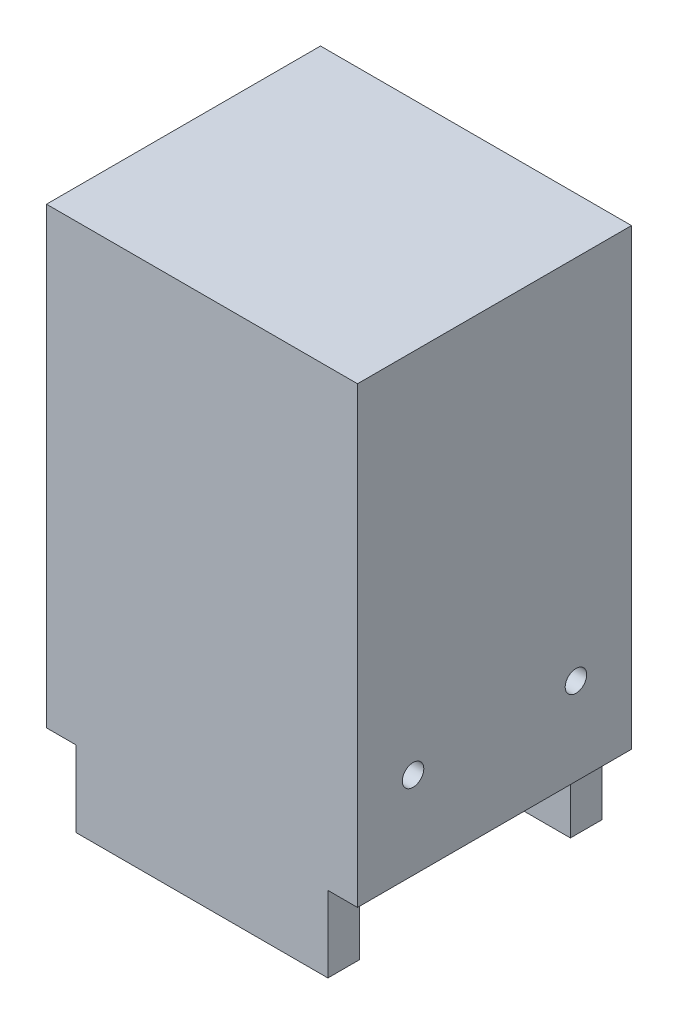
ISO-10303-21;
HEADER;
FILE_DESCRIPTION(('STEP AP214'),'2;1');
FILE_NAME('part.step','',(''),(''),'','','');
FILE_SCHEMA(('AUTOMOTIVE_DESIGN { 1 0 10303 214 1 1 1 1 }'));
ENDSEC;
DATA;
#1=APPLICATION_CONTEXT('core data for automotive mechanical design processes');
#2=APPLICATION_PROTOCOL_DEFINITION('international standard','automotive_design',2000,#1);
#3=PRODUCT_CONTEXT('',#1,'mechanical');
#4=PRODUCT('Part','Part','',(#3));
#5=PRODUCT_RELATED_PRODUCT_CATEGORY('part','',(#4));
#6=PRODUCT_DEFINITION_FORMATION('','',#4);
#7=PRODUCT_DEFINITION_CONTEXT('part definition',#1,'design');
#8=PRODUCT_DEFINITION('design','',#6,#7);
#9=PRODUCT_DEFINITION_SHAPE('','',#8);
#10=(LENGTH_UNIT() NAMED_UNIT(*) SI_UNIT(.MILLI.,.METRE.));
#11=(NAMED_UNIT(*) PLANE_ANGLE_UNIT() SI_UNIT($,.RADIAN.));
#12=(NAMED_UNIT(*) SI_UNIT($,.STERADIAN.) SOLID_ANGLE_UNIT());
#13=UNCERTAINTY_MEASURE_WITH_UNIT(LENGTH_MEASURE(1.E-05),#10,'distance_accuracy_value','');
#14=(GEOMETRIC_REPRESENTATION_CONTEXT(3) GLOBAL_UNCERTAINTY_ASSIGNED_CONTEXT((#13)) GLOBAL_UNIT_ASSIGNED_CONTEXT((#10,
#11,#12)) REPRESENTATION_CONTEXT('',''));
#15=CARTESIAN_POINT('',(0.,0.,0.));
#16=DIRECTION('',(0.,0.,1.));
#17=DIRECTION('',(1.,0.,0.));
#18=AXIS2_PLACEMENT_3D('',#15,#16,#17);
#19=CARTESIAN_POINT('',(-17.,0.,-55.));
#20=DIRECTION('',(1.,0.,0.));
#21=DIRECTION('',(0.,1.,0.));
#22=AXIS2_PLACEMENT_3D('',#19,#20,#21);
#23=PLANE('',#22);
#24=DIRECTION('',(0.,0.,1.));
#25=VECTOR('',#24,1.);
#26=CARTESIAN_POINT('',(-17.,-144.75,-55.));
#27=LINE('',#26,#25);
#28=CARTESIAN_POINT('',(-17.,-144.75,-41.75));
#29=VERTEX_POINT('',#28);
#30=CARTESIAN_POINT('',(-17.,-144.75,-13.25));
#31=VERTEX_POINT('',#30);
#32=EDGE_CURVE('E299',#29,#31,#27,.T.);
#33=ORIENTED_EDGE('',*,*,#32,.T.);
#34=DIRECTION('',(0.,1.,0.));
#35=VECTOR('',#34,1.);
#36=CARTESIAN_POINT('',(-17.,-169.75,-13.25));
#37=LINE('',#36,#35);
#38=CARTESIAN_POINT('',(-17.,-159.75,-13.25));
#39=VERTEX_POINT('',#38);
#40=EDGE_CURVE('E315',#39,#31,#37,.T.);
#41=ORIENTED_EDGE('',*,*,#40,.F.);
#42=DIRECTION('',(0.,0.,1.));
#43=VECTOR('',#42,1.);
#44=CARTESIAN_POINT('',(-17.,-159.75,-55.));
#45=LINE('',#44,#43);
#46=CARTESIAN_POINT('',(-17.,-159.75,-41.75));
#47=VERTEX_POINT('',#46);
#48=EDGE_CURVE('E275',#47,#39,#45,.T.);
#49=ORIENTED_EDGE('',*,*,#48,.F.);
#50=DIRECTION('',(0.,1.,0.));
#51=VECTOR('',#50,1.);
#52=CARTESIAN_POINT('',(-17.,-169.75,-41.75));
#53=LINE('',#52,#51);
#54=EDGE_CURVE('E292',#47,#29,#53,.T.);
#55=ORIENTED_EDGE('',*,*,#54,.T.);
#56=EDGE_LOOP('',(#33,#41,#49,#55));
#57=FACE_BOUND('',#56,.T.);
#58=CARTESIAN_POINT('',(-17.,-148.,-16.5));
#59=DIRECTION('',(1.,0.,0.));
#60=DIRECTION('',(0.,0.,-1.));
#61=AXIS2_PLACEMENT_3D('',#58,#59,#60);
#62=CIRCLE('',#61,1.45);
#63=CARTESIAN_POINT('',(-17.,-148.,-17.95));
#64=VERTEX_POINT('',#63);
#65=EDGE_CURVE('E196',#64,#64,#62,.T.);
#66=ORIENTED_EDGE('',*,*,#65,.F.);
#67=EDGE_LOOP('',(#66));
#68=FACE_BOUND('',#67,.T.);
#69=CARTESIAN_POINT('',(-17.,-148.,-38.5));
#70=DIRECTION('',(1.,0.,0.));
#71=DIRECTION('',(0.,0.,-1.));
#72=AXIS2_PLACEMENT_3D('',#69,#70,#71);
#73=CIRCLE('',#72,1.45);
#74=CARTESIAN_POINT('',(-17.,-148.,-39.95));
#75=VERTEX_POINT('',#74);
#76=EDGE_CURVE('E205',#75,#75,#73,.T.);
#77=ORIENTED_EDGE('',*,*,#76,.F.);
#78=EDGE_LOOP('',(#77));
#79=FACE_BOUND('',#78,.T.);
#80=ADVANCED_FACE('F47',(#57,#68,#79),#23,.T.);
#81=CARTESIAN_POINT('',(0.,-144.75,-55.));
#82=DIRECTION('',(0.,1.,0.));
#83=DIRECTION('',(0.,0.,1.));
#84=AXIS2_PLACEMENT_3D('',#81,#82,#83);
#85=PLANE('',#84);
#86=DIRECTION('',(-1.,0.,0.));
#87=VECTOR('',#86,1.);
#88=CARTESIAN_POINT('',(-17.,-144.75,-41.75));
#89=LINE('',#88,#87);
#90=CARTESIAN_POINT('',(17.,-144.75,-41.75));
#91=VERTEX_POINT('',#90);
#92=EDGE_CURVE('E323',#91,#29,#89,.T.);
#93=ORIENTED_EDGE('',*,*,#92,.F.);
#94=DIRECTION('',(0.,0.,1.));
#95=VECTOR('',#94,1.);
#96=CARTESIAN_POINT('',(17.,-144.75,-55.));
#97=LINE('',#96,#95);
#98=CARTESIAN_POINT('',(17.,-144.75,-13.25));
#99=VERTEX_POINT('',#98);
#100=EDGE_CURVE('E298',#91,#99,#97,.T.);
#101=ORIENTED_EDGE('',*,*,#100,.T.);
#102=DIRECTION('',(1.,0.,0.));
#103=VECTOR('',#102,1.);
#104=CARTESIAN_POINT('',(-17.,-144.75,-13.25));
#105=LINE('',#104,#103);
#106=EDGE_CURVE('E192',#31,#99,#105,.T.);
#107=ORIENTED_EDGE('',*,*,#106,.F.);
#108=ORIENTED_EDGE('',*,*,#32,.F.);
#109=EDGE_LOOP('',(#93,#101,#107,#108));
#110=FACE_BOUND('',#109,.T.);
#111=ADVANCED_FACE('F339',(#110),#85,.F.);
#112=CARTESIAN_POINT('',(17.,0.,-55.));
#113=DIRECTION('',(1.,0.,0.));
#114=DIRECTION('',(0.,0.,-1.));
#115=AXIS2_PLACEMENT_3D('',#112,#113,#114);
#116=PLANE('',#115);
#117=DIRECTION('',(0.,1.,0.));
#118=VECTOR('',#117,1.);
#119=CARTESIAN_POINT('',(17.,-169.75,-13.25));
#120=LINE('',#119,#118);
#121=CARTESIAN_POINT('',(17.,-159.75,-13.25));
#122=VERTEX_POINT('',#121);
#123=EDGE_CURVE('E305',#122,#99,#120,.T.);
#124=ORIENTED_EDGE('',*,*,#123,.T.);
#125=ORIENTED_EDGE('',*,*,#100,.F.);
#126=DIRECTION('',(0.,1.,0.));
#127=VECTOR('',#126,1.);
#128=CARTESIAN_POINT('',(17.,-169.75,-41.75));
#129=LINE('',#128,#127);
#130=CARTESIAN_POINT('',(17.,-159.75,-41.75));
#131=VERTEX_POINT('',#130);
#132=EDGE_CURVE('E320',#131,#91,#129,.T.);
#133=ORIENTED_EDGE('',*,*,#132,.F.);
#134=DIRECTION('',(0.,0.,1.));
#135=VECTOR('',#134,1.);
#136=CARTESIAN_POINT('',(17.,-159.75,-55.));
#137=LINE('',#136,#135);
#138=EDGE_CURVE('E188',#131,#122,#137,.T.);
#139=ORIENTED_EDGE('',*,*,#138,.T.);
#140=EDGE_LOOP('',(#124,#125,#133,#139));
#141=FACE_BOUND('',#140,.T.);
#142=CARTESIAN_POINT('',(17.,-148.,-16.5));
#143=DIRECTION('',(1.,0.,0.));
#144=DIRECTION('',(0.,0.,-1.));
#145=AXIS2_PLACEMENT_3D('',#142,#143,#144);
#146=CIRCLE('',#145,1.45);
#147=CARTESIAN_POINT('',(17.,-148.,-17.95));
#148=VERTEX_POINT('',#147);
#149=EDGE_CURVE('E183',#148,#148,#146,.T.);
#150=ORIENTED_EDGE('',*,*,#149,.T.);
#151=EDGE_LOOP('',(#150));
#152=FACE_BOUND('',#151,.T.);
#153=CARTESIAN_POINT('',(17.,-148.,-38.5));
#154=DIRECTION('',(1.,0.,0.));
#155=DIRECTION('',(0.,0.,-1.));
#156=AXIS2_PLACEMENT_3D('',#153,#154,#155);
#157=CIRCLE('',#156,1.45);
#158=CARTESIAN_POINT('',(17.,-148.,-39.95));
#159=VERTEX_POINT('',#158);
#160=EDGE_CURVE('E187',#159,#159,#157,.T.);
#161=ORIENTED_EDGE('',*,*,#160,.T.);
#162=EDGE_LOOP('',(#161));
#163=FACE_BOUND('',#162,.T.);
#164=ADVANCED_FACE('F345',(#141,#152,#163),#116,.F.);
#165=CARTESIAN_POINT('',(-17.,-169.75,-13.25));
#166=DIRECTION('',(0.,0.,1.));
#167=DIRECTION('',(1.,0.,0.));
#168=AXIS2_PLACEMENT_3D('',#165,#166,#167);
#169=PLANE('',#168);
#170=ORIENTED_EDGE('',*,*,#106,.T.);
#171=ORIENTED_EDGE('',*,*,#123,.F.);
#172=CARTESIAN_POINT('',(17.,-170.,-13.25));
#173=VERTEX_POINT('',#172);
#174=EDGE_CURVE('E316',#173,#122,#120,.T.);
#175=ORIENTED_EDGE('',*,*,#174,.F.);
#176=DIRECTION('',(1.,0.,0.));
#177=VECTOR('',#176,1.);
#178=CARTESIAN_POINT('',(0.,-170.,-13.25));
#179=LINE('',#178,#177);
#180=CARTESIAN_POINT('',(-17.,-170.,-13.25));
#181=VERTEX_POINT('',#180);
#182=EDGE_CURVE('E278',#181,#173,#179,.T.);
#183=ORIENTED_EDGE('',*,*,#182,.F.);
#184=EDGE_CURVE('E311',#181,#39,#37,.T.);
#185=ORIENTED_EDGE('',*,*,#184,.T.);
#186=ORIENTED_EDGE('',*,*,#40,.T.);
#187=EDGE_LOOP('',(#170,#171,#175,#183,#185,#186));
#188=FACE_BOUND('',#187,.T.);
#189=ADVANCED_FACE('F335',(#188),#169,.F.);
#190=CARTESIAN_POINT('',(-17.,-169.75,-41.75));
#191=DIRECTION('',(0.,0.,-1.));
#192=DIRECTION('',(-1.,0.,0.));
#193=AXIS2_PLACEMENT_3D('',#190,#191,#192);
#194=PLANE('',#193);
#195=ORIENTED_EDGE('',*,*,#92,.T.);
#196=ORIENTED_EDGE('',*,*,#54,.F.);
#197=CARTESIAN_POINT('',(-17.,-170.,-41.75));
#198=VERTEX_POINT('',#197);
#199=EDGE_CURVE('E251',#198,#47,#53,.T.);
#200=ORIENTED_EDGE('',*,*,#199,.F.);
#201=DIRECTION('',(1.,0.,0.));
#202=VECTOR('',#201,1.);
#203=CARTESIAN_POINT('',(0.,-170.,-41.75));
#204=LINE('',#203,#202);
#205=CARTESIAN_POINT('',(17.,-170.,-41.75));
#206=VERTEX_POINT('',#205);
#207=EDGE_CURVE('E325',#198,#206,#204,.T.);
#208=ORIENTED_EDGE('',*,*,#207,.T.);
#209=EDGE_CURVE('E331',#206,#131,#129,.T.);
#210=ORIENTED_EDGE('',*,*,#209,.T.);
#211=ORIENTED_EDGE('',*,*,#132,.T.);
#212=EDGE_LOOP('',(#195,#196,#200,#208,#210,#211));
#213=FACE_BOUND('',#212,.T.);
#214=ADVANCED_FACE('F361',(#213),#194,.F.);
#215=CARTESIAN_POINT('',(17.,0.,0.));
#216=DIRECTION('',(1.,0.,0.));
#217=DIRECTION('',(0.,1.,0.));
#218=AXIS2_PLACEMENT_3D('',#215,#216,#217);
#219=PLANE('',#218);
#220=DIRECTION('',(0.,1.,0.));
#221=VECTOR('',#220,1.);
#222=CARTESIAN_POINT('',(17.,0.,-9.00000000000001));
#223=LINE('',#222,#221);
#224=CARTESIAN_POINT('',(17.,-170.,-9.00000000000001));
#225=VERTEX_POINT('',#224);
#226=CARTESIAN_POINT('',(17.,-159.75,-9.00000000000001));
#227=VERTEX_POINT('',#226);
#228=EDGE_CURVE('E180',#225,#227,#223,.T.);
#229=ORIENTED_EDGE('',*,*,#228,.F.);
#230=DIRECTION('',(0.,0.,1.));
#231=VECTOR('',#230,1.);
#232=CARTESIAN_POINT('',(17.,-170.,-13.25));
#233=LINE('',#232,#231);
#234=EDGE_CURVE('E284',#173,#225,#233,.T.);
#235=ORIENTED_EDGE('',*,*,#234,.F.);
#236=ORIENTED_EDGE('',*,*,#174,.T.);
#237=EDGE_CURVE('E319',#122,#227,#137,.T.);
#238=ORIENTED_EDGE('',*,*,#237,.T.);
#239=EDGE_LOOP('',(#229,#235,#236,#238));
#240=FACE_BOUND('',#239,.T.);
#241=ADVANCED_FACE('F355',(#240),#219,.T.);
#242=DIRECTION('',(0.,-1.,0.));
#243=VECTOR('',#242,1.);
#244=CARTESIAN_POINT('',(17.,0.,-46.));
#245=LINE('',#244,#243);
#246=CARTESIAN_POINT('',(17.,-159.75,-46.));
#247=VERTEX_POINT('',#246);
#248=CARTESIAN_POINT('',(17.,-170.,-46.));
#249=VERTEX_POINT('',#248);
#250=EDGE_CURVE('E233',#247,#249,#245,.T.);
#251=ORIENTED_EDGE('',*,*,#250,.F.);
#252=EDGE_CURVE('E350',#247,#131,#137,.T.);
#253=ORIENTED_EDGE('',*,*,#252,.T.);
#254=ORIENTED_EDGE('',*,*,#209,.F.);
#255=DIRECTION('',(0.,0.,-1.));
#256=VECTOR('',#255,1.);
#257=CARTESIAN_POINT('',(17.,-170.,-41.75));
#258=LINE('',#257,#256);
#259=EDGE_CURVE('E258',#206,#249,#258,.T.);
#260=ORIENTED_EDGE('',*,*,#259,.T.);
#261=EDGE_LOOP('',(#251,#253,#254,#260));
#262=FACE_BOUND('',#261,.T.);
#263=ADVANCED_FACE('F367',(#262),#219,.T.);
#264=CARTESIAN_POINT('',(17.,-159.75,-55.));
#265=DIRECTION('',(0.,1.,0.));
#266=DIRECTION('',(-1.,0.,0.));
#267=AXIS2_PLACEMENT_3D('',#264,#265,#266);
#268=PLANE('',#267);
#269=DIRECTION('',(0.,0.,1.));
#270=VECTOR('',#269,1.);
#271=CARTESIAN_POINT('',(21.,-159.75,-55.));
#272=LINE('',#271,#270);
#273=CARTESIAN_POINT('',(21.,-159.75,-46.));
#274=VERTEX_POINT('',#273);
#275=CARTESIAN_POINT('',(21.,-159.75,-9.00000000000001));
#276=VERTEX_POINT('',#275);
#277=EDGE_CURVE('E253',#274,#276,#272,.T.);
#278=ORIENTED_EDGE('',*,*,#277,.T.);
#279=DIRECTION('',(-1.,0.,0.));
#280=VECTOR('',#279,1.);
#281=CARTESIAN_POINT('',(17.,-159.75,-9.00000000000001));
#282=LINE('',#281,#280);
#283=EDGE_CURVE('E166',#276,#227,#282,.T.);
#284=ORIENTED_EDGE('',*,*,#283,.T.);
#285=ORIENTED_EDGE('',*,*,#237,.F.);
#286=ORIENTED_EDGE('',*,*,#138,.F.);
#287=ORIENTED_EDGE('',*,*,#252,.F.);
#288=DIRECTION('',(1.,0.,0.));
#289=VECTOR('',#288,1.);
#290=CARTESIAN_POINT('',(17.,-159.75,-46.));
#291=LINE('',#290,#289);
#292=EDGE_CURVE('E242',#247,#274,#291,.T.);
#293=ORIENTED_EDGE('',*,*,#292,.T.);
#294=EDGE_LOOP('',(#278,#284,#285,#286,#287,#293));
#295=FACE_BOUND('',#294,.T.);
#296=ADVANCED_FACE('F358',(#295),#268,.F.);
#297=CARTESIAN_POINT('',(-17.,0.,0.));
#298=DIRECTION('',(-1.,0.,0.));
#299=DIRECTION('',(0.,1.,0.));
#300=AXIS2_PLACEMENT_3D('',#297,#298,#299);
#301=PLANE('',#300);
#302=DIRECTION('',(0.,-1.,0.));
#303=VECTOR('',#302,1.);
#304=CARTESIAN_POINT('',(-17.,0.,-9.00000000000001));
#305=LINE('',#304,#303);
#306=CARTESIAN_POINT('',(-17.,-159.75,-9.00000000000001));
#307=VERTEX_POINT('',#306);
#308=CARTESIAN_POINT('',(-17.,-170.,-9.00000000000001));
#309=VERTEX_POINT('',#308);
#310=EDGE_CURVE('E181',#307,#309,#305,.T.);
#311=ORIENTED_EDGE('',*,*,#310,.F.);
#312=EDGE_CURVE('E270',#39,#307,#45,.T.);
#313=ORIENTED_EDGE('',*,*,#312,.F.);
#314=ORIENTED_EDGE('',*,*,#184,.F.);
#315=DIRECTION('',(0.,0.,1.));
#316=VECTOR('',#315,1.);
#317=CARTESIAN_POINT('',(-17.,-170.,-13.25));
#318=LINE('',#317,#316);
#319=EDGE_CURVE('E245',#181,#309,#318,.T.);
#320=ORIENTED_EDGE('',*,*,#319,.T.);
#321=EDGE_LOOP('',(#311,#313,#314,#320));
#322=FACE_BOUND('',#321,.T.);
#323=ADVANCED_FACE('F269',(#322),#301,.T.);
#324=DIRECTION('',(0.,1.,0.));
#325=VECTOR('',#324,1.);
#326=CARTESIAN_POINT('',(-17.,0.,-46.));
#327=LINE('',#326,#325);
#328=CARTESIAN_POINT('',(-17.,-170.,-46.));
#329=VERTEX_POINT('',#328);
#330=CARTESIAN_POINT('',(-17.,-159.75,-46.));
#331=VERTEX_POINT('',#330);
#332=EDGE_CURVE('E222',#329,#331,#327,.T.);
#333=ORIENTED_EDGE('',*,*,#332,.F.);
#334=DIRECTION('',(0.,0.,-1.));
#335=VECTOR('',#334,1.);
#336=CARTESIAN_POINT('',(-17.,-170.,-41.75));
#337=LINE('',#336,#335);
#338=EDGE_CURVE('E152',#198,#329,#337,.T.);
#339=ORIENTED_EDGE('',*,*,#338,.F.);
#340=ORIENTED_EDGE('',*,*,#199,.T.);
#341=EDGE_CURVE('E280',#331,#47,#45,.T.);
#342=ORIENTED_EDGE('',*,*,#341,.F.);
#343=EDGE_LOOP('',(#333,#339,#340,#342));
#344=FACE_BOUND('',#343,.T.);
#345=ADVANCED_FACE('F383',(#344),#301,.T.);
#346=CARTESIAN_POINT('',(-17.,-159.75,-55.));
#347=DIRECTION('',(0.,-1.,0.));
#348=DIRECTION('',(1.,0.,0.));
#349=AXIS2_PLACEMENT_3D('',#346,#347,#348);
#350=PLANE('',#349);
#351=DIRECTION('',(1.,0.,0.));
#352=VECTOR('',#351,1.);
#353=CARTESIAN_POINT('',(-17.,-159.75,-9.00000000000001));
#354=LINE('',#353,#352);
#355=CARTESIAN_POINT('',(-21.,-159.75,-9.00000000000001));
#356=VERTEX_POINT('',#355);
#357=EDGE_CURVE('E151',#356,#307,#354,.T.);
#358=ORIENTED_EDGE('',*,*,#357,.F.);
#359=DIRECTION('',(0.,0.,1.));
#360=VECTOR('',#359,1.);
#361=CARTESIAN_POINT('',(-21.,-159.75,-55.));
#362=LINE('',#361,#360);
#363=CARTESIAN_POINT('',(-21.,-159.75,-46.));
#364=VERTEX_POINT('',#363);
#365=EDGE_CURVE('E201',#364,#356,#362,.T.);
#366=ORIENTED_EDGE('',*,*,#365,.F.);
#367=DIRECTION('',(-1.,0.,0.));
#368=VECTOR('',#367,1.);
#369=CARTESIAN_POINT('',(-17.,-159.75,-46.));
#370=LINE('',#369,#368);
#371=EDGE_CURVE('E215',#331,#364,#370,.T.);
#372=ORIENTED_EDGE('',*,*,#371,.F.);
#373=ORIENTED_EDGE('',*,*,#341,.T.);
#374=ORIENTED_EDGE('',*,*,#48,.T.);
#375=ORIENTED_EDGE('',*,*,#312,.T.);
#376=EDGE_LOOP('',(#358,#366,#372,#373,#374,#375));
#377=FACE_BOUND('',#376,.T.);
#378=ADVANCED_FACE('F273',(#377),#350,.T.);
#379=CARTESIAN_POINT('',(0.,-170.,-13.25));
#380=DIRECTION('',(0.,-1.,0.));
#381=DIRECTION('',(0.,0.,-1.));
#382=AXIS2_PLACEMENT_3D('',#379,#380,#381);
#383=PLANE('',#382);
#384=DIRECTION('',(1.,0.,0.));
#385=VECTOR('',#384,1.);
#386=CARTESIAN_POINT('',(-21.,-170.,-9.00000000000001));
#387=LINE('',#386,#385);
#388=EDGE_CURVE('E178',#309,#225,#387,.T.);
#389=ORIENTED_EDGE('',*,*,#388,.F.);
#390=ORIENTED_EDGE('',*,*,#319,.F.);
#391=ORIENTED_EDGE('',*,*,#182,.T.);
#392=ORIENTED_EDGE('',*,*,#234,.T.);
#393=EDGE_LOOP('',(#389,#390,#391,#392));
#394=FACE_BOUND('',#393,.T.);
#395=ADVANCED_FACE('F377',(#394),#383,.T.);
#396=CARTESIAN_POINT('',(0.,-170.,-41.75));
#397=DIRECTION('',(0.,1.,0.));
#398=DIRECTION('',(0.,0.,1.));
#399=AXIS2_PLACEMENT_3D('',#396,#397,#398);
#400=PLANE('',#399);
#401=ORIENTED_EDGE('',*,*,#338,.T.);
#402=DIRECTION('',(-1.,0.,0.));
#403=VECTOR('',#402,1.);
#404=CARTESIAN_POINT('',(21.,-170.,-46.));
#405=LINE('',#404,#403);
#406=EDGE_CURVE('E229',#249,#329,#405,.T.);
#407=ORIENTED_EDGE('',*,*,#406,.F.);
#408=ORIENTED_EDGE('',*,*,#259,.F.);
#409=ORIENTED_EDGE('',*,*,#207,.F.);
#410=EDGE_LOOP('',(#401,#407,#408,#409));
#411=FACE_BOUND('',#410,.T.);
#412=ADVANCED_FACE('F384',(#411),#400,.F.);
#413=CARTESIAN_POINT('',(-25.,0.,-9.00000000000001));
#414=DIRECTION('',(0.,0.,1.));
#415=DIRECTION('',(1.,0.,0.));
#416=AXIS2_PLACEMENT_3D('',#413,#414,#415);
#417=PLANE('',#416);
#418=DIRECTION('',(-1.,0.,0.));
#419=VECTOR('',#418,1.);
#420=CARTESIAN_POINT('',(21.,-98.5,-9.00000000000001));
#421=LINE('',#420,#419);
#422=CARTESIAN_POINT('',(21.,-98.5,-9.00000000000001));
#423=VERTEX_POINT('',#422);
#424=CARTESIAN_POINT('',(-21.,-98.5,-9.00000000000001));
#425=VERTEX_POINT('',#424);
#426=EDGE_CURVE('E143',#423,#425,#421,.T.);
#427=ORIENTED_EDGE('',*,*,#426,.T.);
#428=DIRECTION('',(0.,1.,0.));
#429=VECTOR('',#428,1.);
#430=CARTESIAN_POINT('',(-21.,0.,-9.00000000000001));
#431=LINE('',#430,#429);
#432=EDGE_CURVE('E213',#356,#425,#431,.T.);
#433=ORIENTED_EDGE('',*,*,#432,.F.);
#434=ORIENTED_EDGE('',*,*,#357,.T.);
#435=ORIENTED_EDGE('',*,*,#310,.T.);
#436=ORIENTED_EDGE('',*,*,#388,.T.);
#437=ORIENTED_EDGE('',*,*,#228,.T.);
#438=ORIENTED_EDGE('',*,*,#283,.F.);
#439=DIRECTION('',(0.,-1.,0.));
#440=VECTOR('',#439,1.);
#441=CARTESIAN_POINT('',(21.,-6.50000000000003,-9.00000000000001));
#442=LINE('',#441,#440);
#443=EDGE_CURVE('E159',#423,#276,#442,.T.);
#444=ORIENTED_EDGE('',*,*,#443,.F.);
#445=EDGE_LOOP('',(#427,#433,#434,#435,#436,#437,#438,#444));
#446=FACE_BOUND('',#445,.T.);
#447=ADVANCED_FACE('F49',(#446),#417,.T.);
#448=CARTESIAN_POINT('',(-25.,0.,-46.));
#449=DIRECTION('',(0.,0.,1.));
#450=DIRECTION('',(1.,0.,0.));
#451=AXIS2_PLACEMENT_3D('',#448,#449,#450);
#452=PLANE('',#451);
#453=DIRECTION('',(0.,1.,0.));
#454=VECTOR('',#453,1.);
#455=CARTESIAN_POINT('',(-21.,0.,-46.));
#456=LINE('',#455,#454);
#457=CARTESIAN_POINT('',(-21.,-98.5,-46.));
#458=VERTEX_POINT('',#457);
#459=EDGE_CURVE('E51',#364,#458,#456,.T.);
#460=ORIENTED_EDGE('',*,*,#459,.T.);
#461=DIRECTION('',(-1.,0.,0.));
#462=VECTOR('',#461,1.);
#463=CARTESIAN_POINT('',(21.,-98.5,-46.));
#464=LINE('',#463,#462);
#465=CARTESIAN_POINT('',(21.,-98.5,-46.));
#466=VERTEX_POINT('',#465);
#467=EDGE_CURVE('E11',#466,#458,#464,.T.);
#468=ORIENTED_EDGE('',*,*,#467,.F.);
#469=DIRECTION('',(0.,-1.,0.));
#470=VECTOR('',#469,1.);
#471=CARTESIAN_POINT('',(21.,-6.50000000000003,-46.));
#472=LINE('',#471,#470);
#473=EDGE_CURVE('E161',#466,#274,#472,.T.);
#474=ORIENTED_EDGE('',*,*,#473,.T.);
#475=ORIENTED_EDGE('',*,*,#292,.F.);
#476=ORIENTED_EDGE('',*,*,#250,.T.);
#477=ORIENTED_EDGE('',*,*,#406,.T.);
#478=ORIENTED_EDGE('',*,*,#332,.T.);
#479=ORIENTED_EDGE('',*,*,#371,.T.);
#480=EDGE_LOOP('',(#460,#468,#474,#475,#476,#477,#478,#479));
#481=FACE_BOUND('',#480,.T.);
#482=ADVANCED_FACE('F380',(#481),#452,.F.);
#483=CARTESIAN_POINT('',(-21.,-159.75,-55.));
#484=DIRECTION('',(1.,0.,0.));
#485=DIRECTION('',(0.,0.,-1.));
#486=AXIS2_PLACEMENT_3D('',#483,#484,#485);
#487=PLANE('',#486);
#488=ORIENTED_EDGE('',*,*,#432,.T.);
#489=DIRECTION('',(0.,0.,1.));
#490=VECTOR('',#489,1.);
#491=CARTESIAN_POINT('',(-21.,-98.5,-46.));
#492=LINE('',#491,#490);
#493=EDGE_CURVE('E58',#458,#425,#492,.T.);
#494=ORIENTED_EDGE('',*,*,#493,.F.);
#495=ORIENTED_EDGE('',*,*,#459,.F.);
#496=ORIENTED_EDGE('',*,*,#365,.T.);
#497=EDGE_LOOP('',(#488,#494,#495,#496));
#498=FACE_BOUND('',#497,.T.);
#499=CARTESIAN_POINT('',(-21.,-148.,-16.5));
#500=DIRECTION('',(1.,0.,0.));
#501=DIRECTION('',(0.,0.,-1.));
#502=AXIS2_PLACEMENT_3D('',#499,#500,#501);
#503=CIRCLE('',#502,1.45);
#504=CARTESIAN_POINT('',(-21.,-148.,-17.95));
#505=VERTEX_POINT('',#504);
#506=EDGE_CURVE('E197',#505,#505,#503,.T.);
#507=ORIENTED_EDGE('',*,*,#506,.T.);
#508=EDGE_LOOP('',(#507));
#509=FACE_BOUND('',#508,.T.);
#510=CARTESIAN_POINT('',(-21.,-148.,-38.5));
#511=DIRECTION('',(1.,0.,0.));
#512=DIRECTION('',(0.,0.,-1.));
#513=AXIS2_PLACEMENT_3D('',#510,#511,#512);
#514=CIRCLE('',#513,1.45);
#515=CARTESIAN_POINT('',(-21.,-148.,-39.95));
#516=VERTEX_POINT('',#515);
#517=EDGE_CURVE('E163',#516,#516,#514,.T.);
#518=ORIENTED_EDGE('',*,*,#517,.T.);
#519=EDGE_LOOP('',(#518));
#520=FACE_BOUND('',#519,.T.);
#521=ADVANCED_FACE('F381',(#498,#509,#520),#487,.F.);
#522=CARTESIAN_POINT('',(21.,-159.75,-55.));
#523=DIRECTION('',(-1.,0.,0.));
#524=DIRECTION('',(0.,0.,1.));
#525=AXIS2_PLACEMENT_3D('',#522,#523,#524);
#526=PLANE('',#525);
#527=ORIENTED_EDGE('',*,*,#473,.F.);
#528=DIRECTION('',(0.,0.,1.));
#529=VECTOR('',#528,1.);
#530=CARTESIAN_POINT('',(21.,-98.5,-46.));
#531=LINE('',#530,#529);
#532=EDGE_CURVE('E146',#466,#423,#531,.T.);
#533=ORIENTED_EDGE('',*,*,#532,.T.);
#534=ORIENTED_EDGE('',*,*,#443,.T.);
#535=ORIENTED_EDGE('',*,*,#277,.F.);
#536=EDGE_LOOP('',(#527,#533,#534,#535));
#537=FACE_BOUND('',#536,.T.);
#538=CARTESIAN_POINT('',(21.,-148.,-16.5));
#539=DIRECTION('',(1.,0.,0.));
#540=DIRECTION('',(0.,0.,-1.));
#541=AXIS2_PLACEMENT_3D('',#538,#539,#540);
#542=CIRCLE('',#541,1.45);
#543=CARTESIAN_POINT('',(21.,-148.,-17.95));
#544=VERTEX_POINT('',#543);
#545=EDGE_CURVE('E169',#544,#544,#542,.T.);
#546=ORIENTED_EDGE('',*,*,#545,.F.);
#547=EDGE_LOOP('',(#546));
#548=FACE_BOUND('',#547,.T.);
#549=CARTESIAN_POINT('',(21.,-148.,-38.5));
#550=DIRECTION('',(1.,0.,0.));
#551=DIRECTION('',(0.,0.,-1.));
#552=AXIS2_PLACEMENT_3D('',#549,#550,#551);
#553=CIRCLE('',#552,1.45);
#554=CARTESIAN_POINT('',(21.,-148.,-39.95));
#555=VERTEX_POINT('',#554);
#556=EDGE_CURVE('E173',#555,#555,#553,.T.);
#557=ORIENTED_EDGE('',*,*,#556,.F.);
#558=EDGE_LOOP('',(#557));
#559=FACE_BOUND('',#558,.T.);
#560=ADVANCED_FACE('F156',(#537,#548,#559),#526,.F.);
#561=CARTESIAN_POINT('',(17.,-148.,-16.5));
#562=DIRECTION('',(1.,0.,0.));
#563=DIRECTION('',(0.,0.,-1.));
#564=AXIS2_PLACEMENT_3D('',#561,#562,#563);
#565=CYLINDRICAL_SURFACE('',#564,1.45);
#566=ORIENTED_EDGE('',*,*,#149,.F.);
#567=EDGE_LOOP('',(#566));
#568=FACE_BOUND('',#567,.T.);
#569=ORIENTED_EDGE('',*,*,#545,.T.);
#570=EDGE_LOOP('',(#569));
#571=FACE_BOUND('',#570,.T.);
#572=ADVANCED_FACE('F465',(#568,#571),#565,.F.);
#573=CARTESIAN_POINT('',(17.,-148.,-38.5));
#574=DIRECTION('',(1.,0.,0.));
#575=DIRECTION('',(0.,0.,-1.));
#576=AXIS2_PLACEMENT_3D('',#573,#574,#575);
#577=CYLINDRICAL_SURFACE('',#576,1.45);
#578=ORIENTED_EDGE('',*,*,#160,.F.);
#579=EDGE_LOOP('',(#578));
#580=FACE_BOUND('',#579,.T.);
#581=ORIENTED_EDGE('',*,*,#556,.T.);
#582=EDGE_LOOP('',(#581));
#583=FACE_BOUND('',#582,.T.);
#584=ADVANCED_FACE('F473',(#580,#583),#577,.F.);
#585=CARTESIAN_POINT('',(-17.,-148.,-16.5));
#586=DIRECTION('',(-1.,0.,0.));
#587=DIRECTION('',(0.,0.,1.));
#588=AXIS2_PLACEMENT_3D('',#585,#586,#587);
#589=CYLINDRICAL_SURFACE('',#588,1.45);
#590=ORIENTED_EDGE('',*,*,#65,.T.);
#591=EDGE_LOOP('',(#590));
#592=FACE_BOUND('',#591,.T.);
#593=ORIENTED_EDGE('',*,*,#506,.F.);
#594=EDGE_LOOP('',(#593));
#595=FACE_BOUND('',#594,.T.);
#596=ADVANCED_FACE('F483',(#592,#595),#589,.F.);
#597=CARTESIAN_POINT('',(-17.,-148.,-38.5));
#598=DIRECTION('',(-1.,0.,0.));
#599=DIRECTION('',(0.,0.,1.));
#600=AXIS2_PLACEMENT_3D('',#597,#598,#599);
#601=CYLINDRICAL_SURFACE('',#600,1.45);
#602=ORIENTED_EDGE('',*,*,#76,.T.);
#603=EDGE_LOOP('',(#602));
#604=FACE_BOUND('',#603,.T.);
#605=ORIENTED_EDGE('',*,*,#517,.F.);
#606=EDGE_LOOP('',(#605));
#607=FACE_BOUND('',#606,.T.);
#608=ADVANCED_FACE('F492',(#604,#607),#601,.F.);
#609=CARTESIAN_POINT('',(21.,-98.5,-46.));
#610=DIRECTION('',(0.,-1.,0.));
#611=DIRECTION('',(0.,0.,-1.));
#612=AXIS2_PLACEMENT_3D('',#609,#610,#611);
#613=PLANE('',#612);
#614=ORIENTED_EDGE('',*,*,#493,.T.);
#615=ORIENTED_EDGE('',*,*,#426,.F.);
#616=ORIENTED_EDGE('',*,*,#532,.F.);
#617=ORIENTED_EDGE('',*,*,#467,.T.);
#618=EDGE_LOOP('',(#614,#615,#616,#617));
#619=FACE_BOUND('',#618,.T.);
#620=ADVANCED_FACE('F145',(#619),#613,.F.);
#621=CLOSED_SHELL('',(#80,#111,#164,#189,#214,#241,#263,#296,#323,#345,#378,#395,#412,#447,#482,
#521,#560,#572,#584,#596,#608,#620));
#622=MANIFOLD_SOLID_BREP('B2',#621);
#623=ADVANCED_BREP_SHAPE_REPRESENTATION('',(#18,#622),#14);
#624=SHAPE_DEFINITION_REPRESENTATION(#9,#623);
ENDSEC;
END-ISO-10303-21;
